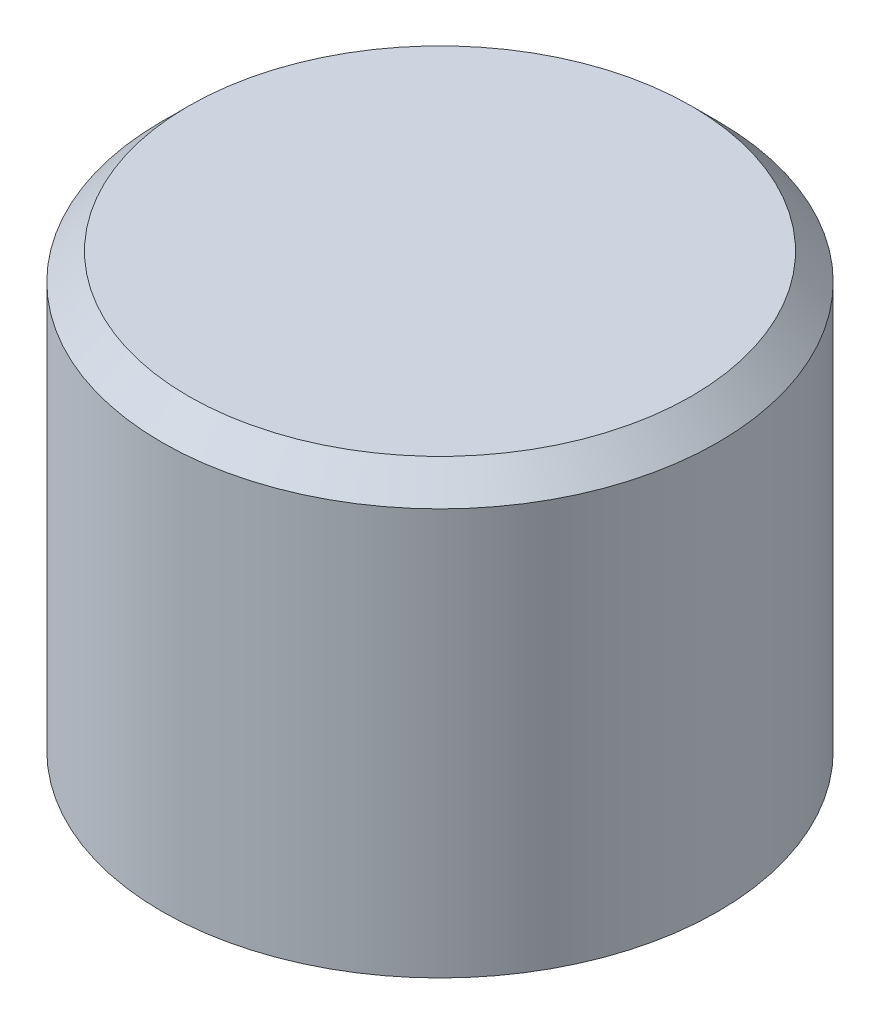
ISO-10303-21;
HEADER;
FILE_DESCRIPTION(('STEP AP214'),'2;1');
FILE_NAME('part.step','',(''),(''),'','','');
FILE_SCHEMA(('AUTOMOTIVE_DESIGN { 1 0 10303 214 1 1 1 1 }'));
ENDSEC;
DATA;
#1=APPLICATION_CONTEXT('core data for automotive mechanical design processes');
#2=APPLICATION_PROTOCOL_DEFINITION('international standard','automotive_design',2000,#1);
#3=PRODUCT_CONTEXT('',#1,'mechanical');
#4=PRODUCT('Part','Part','',(#3));
#5=PRODUCT_RELATED_PRODUCT_CATEGORY('part','',(#4));
#6=PRODUCT_DEFINITION_FORMATION('','',#4);
#7=PRODUCT_DEFINITION_CONTEXT('part definition',#1,'design');
#8=PRODUCT_DEFINITION('design','',#6,#7);
#9=PRODUCT_DEFINITION_SHAPE('','',#8);
#10=(LENGTH_UNIT() NAMED_UNIT(*) SI_UNIT(.MILLI.,.METRE.));
#11=(NAMED_UNIT(*) PLANE_ANGLE_UNIT() SI_UNIT($,.RADIAN.));
#12=(NAMED_UNIT(*) SI_UNIT($,.STERADIAN.) SOLID_ANGLE_UNIT());
#13=UNCERTAINTY_MEASURE_WITH_UNIT(LENGTH_MEASURE(1.E-05),#10,'distance_accuracy_value','');
#14=(GEOMETRIC_REPRESENTATION_CONTEXT(3) GLOBAL_UNCERTAINTY_ASSIGNED_CONTEXT((#13)) GLOBAL_UNIT_ASSIGNED_CONTEXT((#10,
#11,#12)) REPRESENTATION_CONTEXT('',''));
#15=CARTESIAN_POINT('',(0.,0.,0.));
#16=DIRECTION('',(0.,0.,1.));
#17=DIRECTION('',(1.,0.,0.));
#18=AXIS2_PLACEMENT_3D('',#15,#16,#17);
#19=CARTESIAN_POINT('',(0.,0.,0.));
#20=DIRECTION('',(0.,-1.,0.));
#21=DIRECTION('',(0.,0.,-1.));
#22=AXIS2_PLACEMENT_3D('',#19,#20,#21);
#23=PLANE('',#22);
#24=CARTESIAN_POINT('',(0.,0.,0.));
#25=DIRECTION('',(0.,-1.,0.));
#26=DIRECTION('',(0.,0.,-1.));
#27=AXIS2_PLACEMENT_3D('',#24,#25,#26);
#28=CIRCLE('',#27,7.55);
#29=CARTESIAN_POINT('',(0.,0.,-7.55));
#30=VERTEX_POINT('',#29);
#31=EDGE_CURVE('E10',#30,#30,#28,.F.);
#32=ORIENTED_EDGE('',*,*,#31,.T.);
#33=EDGE_LOOP('',(#32));
#34=FACE_BOUND('',#33,.T.);
#35=ADVANCED_FACE('F35',(#34),#23,.F.);
#36=CARTESIAN_POINT('',(0.,-3.,0.));
#37=DIRECTION('',(0.,-1.,0.));
#38=DIRECTION('',(0.,0.,-1.));
#39=AXIS2_PLACEMENT_3D('',#36,#37,#38);
#40=CYLINDRICAL_SURFACE('',#39,8.35);
#41=CARTESIAN_POINT('',(0.,-0.799999999999999,0.));
#42=DIRECTION('',(0.,-1.,0.));
#43=DIRECTION('',(0.,0.,-1.));
#44=AXIS2_PLACEMENT_3D('',#41,#42,#43);
#45=CIRCLE('',#44,8.35);
#46=CARTESIAN_POINT('',(0.,-0.799999999999999,-8.35));
#47=VERTEX_POINT('',#46);
#48=EDGE_CURVE('E43',#47,#47,#45,.T.);
#49=ORIENTED_EDGE('',*,*,#48,.T.);
#50=EDGE_LOOP('',(#49));
#51=FACE_BOUND('',#50,.T.);
#52=CARTESIAN_POINT('',(0.,-13.,0.));
#53=DIRECTION('',(0.,-1.,0.));
#54=DIRECTION('',(0.,0.,-1.));
#55=AXIS2_PLACEMENT_3D('',#52,#53,#54);
#56=CIRCLE('',#55,8.35);
#57=CARTESIAN_POINT('',(0.,-13.,-8.35));
#58=VERTEX_POINT('',#57);
#59=EDGE_CURVE('E47',#58,#58,#56,.T.);
#60=ORIENTED_EDGE('',*,*,#59,.F.);
#61=EDGE_LOOP('',(#60));
#62=FACE_BOUND('',#61,.T.);
#63=ADVANCED_FACE('F89',(#51,#62),#40,.T.);
#64=CARTESIAN_POINT('',(-8.35,-13.,0.));
#65=DIRECTION('',(0.,1.,0.));
#66=DIRECTION('',(0.,0.,1.));
#67=AXIS2_PLACEMENT_3D('',#64,#65,#66);
#68=PLANE('',#67);
#69=CARTESIAN_POINT('',(0.,-13.,0.));
#70=DIRECTION('',(0.,-1.,0.));
#71=DIRECTION('',(0.,0.,-1.));
#72=AXIS2_PLACEMENT_3D('',#69,#70,#71);
#73=CIRCLE('',#72,7.5);
#74=CARTESIAN_POINT('',(0.,-13.,-7.5));
#75=VERTEX_POINT('',#74);
#76=EDGE_CURVE('E51',#75,#75,#73,.T.);
#77=ORIENTED_EDGE('',*,*,#76,.F.);
#78=EDGE_LOOP('',(#77));
#79=FACE_BOUND('',#78,.T.);
#80=ORIENTED_EDGE('',*,*,#59,.T.);
#81=EDGE_LOOP('',(#80));
#82=FACE_BOUND('',#81,.T.);
#83=ADVANCED_FACE('F83',(#79,#82),#68,.F.);
#84=CARTESIAN_POINT('',(0.,-3.,0.));
#85=DIRECTION('',(0.,-1.,0.));
#86=DIRECTION('',(0.,0.,-1.));
#87=AXIS2_PLACEMENT_3D('',#84,#85,#86);
#88=CYLINDRICAL_SURFACE('',#87,7.5);
#89=CARTESIAN_POINT('',(0.,-10.7,0.));
#90=DIRECTION('',(0.,-1.,0.));
#91=DIRECTION('',(0.,0.,-1.));
#92=AXIS2_PLACEMENT_3D('',#89,#90,#91);
#93=CIRCLE('',#92,7.5);
#94=CARTESIAN_POINT('',(0.,-10.7,-7.5));
#95=VERTEX_POINT('',#94);
#96=EDGE_CURVE('E56',#95,#95,#93,.T.);
#97=ORIENTED_EDGE('',*,*,#96,.F.);
#98=EDGE_LOOP('',(#97));
#99=FACE_BOUND('',#98,.T.);
#100=ORIENTED_EDGE('',*,*,#76,.T.);
#101=EDGE_LOOP('',(#100));
#102=FACE_BOUND('',#101,.T.);
#103=ADVANCED_FACE('F77',(#99,#102),#88,.F.);
#104=CARTESIAN_POINT('',(-7.5,-10.7,0.));
#105=DIRECTION('',(0.,1.,0.));
#106=DIRECTION('',(0.,0.,1.));
#107=AXIS2_PLACEMENT_3D('',#104,#105,#106);
#108=PLANE('',#107);
#109=CARTESIAN_POINT('',(0.,-10.7,0.));
#110=DIRECTION('',(0.,-1.,0.));
#111=DIRECTION('',(0.,0.,-1.));
#112=AXIS2_PLACEMENT_3D('',#109,#110,#111);
#113=CIRCLE('',#112,2.5);
#114=CARTESIAN_POINT('',(0.,-10.7,-2.5));
#115=VERTEX_POINT('',#114);
#116=EDGE_CURVE('E59',#115,#115,#113,.T.);
#117=ORIENTED_EDGE('',*,*,#116,.F.);
#118=EDGE_LOOP('',(#117));
#119=FACE_BOUND('',#118,.T.);
#120=ORIENTED_EDGE('',*,*,#96,.T.);
#121=EDGE_LOOP('',(#120));
#122=FACE_BOUND('',#121,.T.);
#123=ADVANCED_FACE('F71',(#119,#122),#108,.F.);
#124=CARTESIAN_POINT('',(0.,-3.,0.));
#125=DIRECTION('',(0.,-1.,0.));
#126=DIRECTION('',(0.,0.,-1.));
#127=AXIS2_PLACEMENT_3D('',#124,#125,#126);
#128=CYLINDRICAL_SURFACE('',#127,2.5);
#129=CARTESIAN_POINT('',(0.,-3.,0.));
#130=DIRECTION('',(0.,-1.,0.));
#131=DIRECTION('',(0.,0.,-1.));
#132=AXIS2_PLACEMENT_3D('',#129,#130,#131);
#133=CIRCLE('',#132,2.5);
#134=CARTESIAN_POINT('',(0.,-3.,-2.5));
#135=VERTEX_POINT('',#134);
#136=EDGE_CURVE('E62',#135,#135,#133,.T.);
#137=ORIENTED_EDGE('',*,*,#136,.F.);
#138=EDGE_LOOP('',(#137));
#139=FACE_BOUND('',#138,.T.);
#140=ORIENTED_EDGE('',*,*,#116,.T.);
#141=EDGE_LOOP('',(#140));
#142=FACE_BOUND('',#141,.T.);
#143=ADVANCED_FACE('F68',(#139,#142),#128,.F.);
#144=CARTESIAN_POINT('',(-2.5,-3.,0.));
#145=DIRECTION('',(0.,1.,0.));
#146=DIRECTION('',(0.,0.,1.));
#147=AXIS2_PLACEMENT_3D('',#144,#145,#146);
#148=PLANE('',#147);
#149=ORIENTED_EDGE('',*,*,#136,.T.);
#150=EDGE_LOOP('',(#149));
#151=FACE_BOUND('',#150,.T.);
#152=ADVANCED_FACE('F66',(#151),#148,.F.);
#153=CARTESIAN_POINT('',(0.,-0.799999999999999,0.));
#154=DIRECTION('',(0.,-1.,0.));
#155=DIRECTION('',(0.,0.,-1.));
#156=AXIS2_PLACEMENT_3D('',#153,#154,#155);
#157=CONICAL_SURFACE('',#156,8.35,0.78539816339745);
#158=CARTESIAN_POINT('',(0.,0.,-7.55));
#159=CARTESIAN_POINT('',(0.,-0.00833333333333312,-7.55833333333333));
#160=CARTESIAN_POINT('',(0.,-0.0166666666666665,-7.56666666666666));
#161=CARTESIAN_POINT('',(0.,-0.0333333333333332,-7.58333333333333));
#162=CARTESIAN_POINT('',(0.,-0.0416666666666666,-7.59166666666666));
#163=CARTESIAN_POINT('',(0.,-0.0583333333333332,-7.60833333333333));
#164=CARTESIAN_POINT('',(0.,-0.0666666666666664,-7.61666666666666));
#165=CARTESIAN_POINT('',(0.,-0.083333333333333,-7.63333333333333));
#166=CARTESIAN_POINT('',(0.,-0.0916666666666664,-7.64166666666666));
#167=CARTESIAN_POINT('',(0.,-0.108333333333333,-7.65833333333333));
#168=CARTESIAN_POINT('',(0.,-0.116666666666666,-7.66666666666666));
#169=CARTESIAN_POINT('',(0.,-0.133333333333333,-7.68333333333333));
#170=CARTESIAN_POINT('',(0.,-0.141666666666666,-7.69166666666666));
#171=CARTESIAN_POINT('',(0.,-0.158333333333333,-7.70833333333333));
#172=CARTESIAN_POINT('',(0.,-0.166666666666666,-7.71666666666667));
#173=CARTESIAN_POINT('',(0.,-0.183333333333333,-7.73333333333333));
#174=CARTESIAN_POINT('',(0.,-0.191666666666666,-7.74166666666667));
#175=CARTESIAN_POINT('',(0.,-0.208333333333333,-7.75833333333333));
#176=CARTESIAN_POINT('',(0.,-0.216666666666666,-7.76666666666666));
#177=CARTESIAN_POINT('',(0.,-0.233333333333333,-7.78333333333333));
#178=CARTESIAN_POINT('',(0.,-0.241666666666666,-7.79166666666666));
#179=CARTESIAN_POINT('',(0.,-0.258333333333333,-7.80833333333333));
#180=CARTESIAN_POINT('',(0.,-0.266666666666666,-7.81666666666666));
#181=CARTESIAN_POINT('',(0.,-0.283333333333333,-7.83333333333333));
#182=CARTESIAN_POINT('',(0.,-0.291666666666666,-7.84166666666667));
#183=CARTESIAN_POINT('',(0.,-0.308333333333333,-7.85833333333333));
#184=CARTESIAN_POINT('',(0.,-0.316666666666666,-7.86666666666667));
#185=CARTESIAN_POINT('',(0.,-0.333333333333333,-7.88333333333333));
#186=CARTESIAN_POINT('',(0.,-0.341666666666666,-7.89166666666666));
#187=CARTESIAN_POINT('',(0.,-0.358333333333333,-7.90833333333333));
#188=CARTESIAN_POINT('',(0.,-0.366666666666666,-7.91666666666667));
#189=CARTESIAN_POINT('',(0.,-0.383333333333333,-7.93333333333333));
#190=CARTESIAN_POINT('',(0.,-0.391666666666666,-7.94166666666666));
#191=CARTESIAN_POINT('',(0.,-0.408333333333332,-7.95833333333333));
#192=CARTESIAN_POINT('',(0.,-0.416666666666666,-7.96666666666667));
#193=CARTESIAN_POINT('',(0.,-0.433333333333332,-7.98333333333333));
#194=CARTESIAN_POINT('',(0.,-0.441666666666666,-7.99166666666667));
#195=CARTESIAN_POINT('',(0.,-0.458333333333333,-8.00833333333333));
#196=CARTESIAN_POINT('',(0.,-0.466666666666666,-8.01666666666667));
#197=CARTESIAN_POINT('',(0.,-0.483333333333332,-8.03333333333333));
#198=CARTESIAN_POINT('',(0.,-0.491666666666666,-8.04166666666667));
#199=CARTESIAN_POINT('',(0.,-0.508333333333333,-8.05833333333333));
#200=CARTESIAN_POINT('',(0.,-0.516666666666666,-8.06666666666666));
#201=CARTESIAN_POINT('',(0.,-0.533333333333332,-8.08333333333333));
#202=CARTESIAN_POINT('',(0.,-0.541666666666666,-8.09166666666667));
#203=CARTESIAN_POINT('',(0.,-0.558333333333332,-8.10833333333333));
#204=CARTESIAN_POINT('',(0.,-0.566666666666666,-8.11666666666667));
#205=CARTESIAN_POINT('',(0.,-0.583333333333332,-8.13333333333333));
#206=CARTESIAN_POINT('',(0.,-0.591666666666666,-8.14166666666667));
#207=CARTESIAN_POINT('',(0.,-0.608333333333332,-8.15833333333333));
#208=CARTESIAN_POINT('',(0.,-0.616666666666665,-8.16666666666667));
#209=CARTESIAN_POINT('',(0.,-0.633333333333332,-8.18333333333333));
#210=CARTESIAN_POINT('',(0.,-0.641666666666666,-8.19166666666667));
#211=CARTESIAN_POINT('',(0.,-0.658333333333332,-8.20833333333333));
#212=CARTESIAN_POINT('',(0.,-0.666666666666666,-8.21666666666667));
#213=CARTESIAN_POINT('',(0.,-0.683333333333332,-8.23333333333333));
#214=CARTESIAN_POINT('',(0.,-0.691666666666665,-8.24166666666667));
#215=CARTESIAN_POINT('',(0.,-0.708333333333332,-8.25833333333333));
#216=CARTESIAN_POINT('',(0.,-0.716666666666666,-8.26666666666667));
#217=CARTESIAN_POINT('',(0.,-0.733333333333332,-8.28333333333333));
#218=CARTESIAN_POINT('',(0.,-0.741666666666665,-8.29166666666667));
#219=CARTESIAN_POINT('',(0.,-0.758333333333332,-8.30833333333333));
#220=CARTESIAN_POINT('',(0.,-0.766666666666665,-8.31666666666667));
#221=CARTESIAN_POINT('',(0.,-0.783333333333332,-8.33333333333333));
#222=CARTESIAN_POINT('',(0.,-0.791666666666666,-8.34166666666667));
#223=CARTESIAN_POINT('',(0.,-0.799999999999999,-8.35));
#224=B_SPLINE_CURVE_WITH_KNOTS('',3,(#158,#159,#160,#161,#162,#163,#164,#165,#166,#167,#168,
#169,#170,#171,#172,#173,#174,#175,#176,#177,#178,#179,#180,#181,#182,#183,#184,#185,#186,#187,
#188,#189,#190,#191,#192,#193,#194,#195,#196,#197,#198,#199,#200,#201,#202,#203,#204,#205,#206,
#207,#208,#209,#210,#211,#212,#213,#214,#215,#216,#217,#218,#219,#220,#221,#222,#223),
.UNSPECIFIED.,.F.,.F.,(4,2,2,2,2,2,2,2,2,2,2,2,2,2,2,2,2,2,2,2,2,2,2,2,2,2,2,2,2,2,2,2,4),(0.,
0.0353553390593272,0.0707106781186545,0.106066017177982,0.14142135623731,0.176776695296637,
0.212132034355964,0.247487373415292,0.282842712474619,0.318198051533946,0.353553390593274,
0.388908729652601,0.424264068711929,0.459619407771256,0.494974746830584,0.53033008588991,
0.565685424949238,0.601040764008566,0.636396103067893,0.671751442127221,0.707106781186547,
0.742462120245875,0.777817459305203,0.81317279836453,0.848528137423858,0.883883476483186,
0.919238815542512,0.95459415460184,0.989949493661168,1.02530483272049,1.06066017177982,
1.09601551083915,1.13137084989848),.UNSPECIFIED.);
#225=EDGE_CURVE('BSEAM38',#30,#47,#224,.T.);
#226=ORIENTED_EDGE('',*,*,#31,.F.);
#227=ORIENTED_EDGE('',*,*,#48,.F.);
#228=ORIENTED_EDGE('',*,*,#225,.T.);
#229=ORIENTED_EDGE('',*,*,#225,.F.);
#230=EDGE_LOOP('',(#226,#228,#227,#229));
#231=FACE_BOUND('',#230,.T.);
#232=ADVANCED_FACE('F38',(#231),#157,.T.);
#233=CLOSED_SHELL('',(#35,#63,#83,#103,#123,#143,#152,#232));
#234=MANIFOLD_SOLID_BREP('B2',#233);
#235=ADVANCED_BREP_SHAPE_REPRESENTATION('',(#18,#234),#14);
#236=SHAPE_DEFINITION_REPRESENTATION(#9,#235);
ENDSEC;
END-ISO-10303-21;
